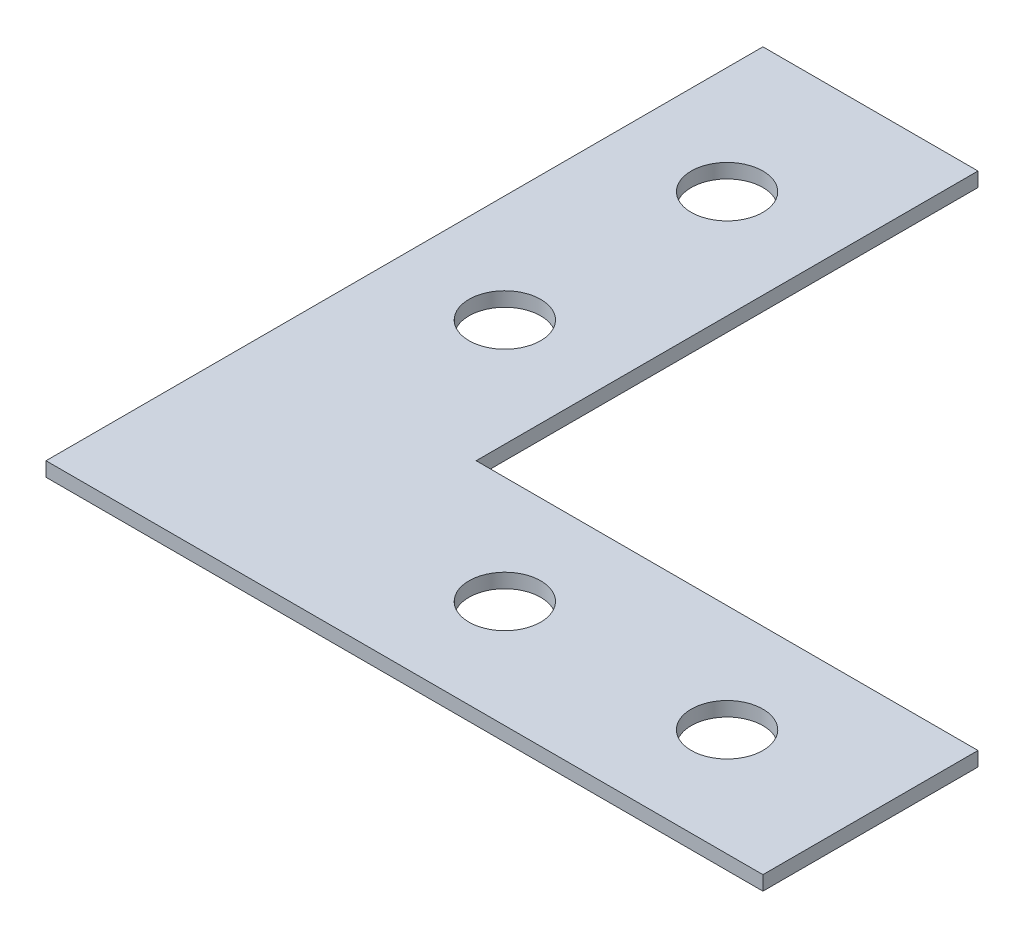
ISO-10303-21;
HEADER;
FILE_DESCRIPTION(('STEP AP214'),'2;1');
FILE_NAME('part.step','',(''),(''),'','','');
FILE_SCHEMA(('AUTOMOTIVE_DESIGN { 1 0 10303 214 1 1 1 1 }'));
ENDSEC;
DATA;
#1=APPLICATION_CONTEXT('core data for automotive mechanical design processes');
#2=APPLICATION_PROTOCOL_DEFINITION('international standard','automotive_design',2000,#1);
#3=PRODUCT_CONTEXT('',#1,'mechanical');
#4=PRODUCT('Part','Part','',(#3));
#5=PRODUCT_RELATED_PRODUCT_CATEGORY('part','',(#4));
#6=PRODUCT_DEFINITION_FORMATION('','',#4);
#7=PRODUCT_DEFINITION_CONTEXT('part definition',#1,'design');
#8=PRODUCT_DEFINITION('design','',#6,#7);
#9=PRODUCT_DEFINITION_SHAPE('','',#8);
#10=(LENGTH_UNIT() NAMED_UNIT(*) SI_UNIT(.MILLI.,.METRE.));
#11=(NAMED_UNIT(*) PLANE_ANGLE_UNIT() SI_UNIT($,.RADIAN.));
#12=(NAMED_UNIT(*) SI_UNIT($,.STERADIAN.) SOLID_ANGLE_UNIT());
#13=UNCERTAINTY_MEASURE_WITH_UNIT(LENGTH_MEASURE(1.E-05),#10,'distance_accuracy_value','');
#14=(GEOMETRIC_REPRESENTATION_CONTEXT(3) GLOBAL_UNCERTAINTY_ASSIGNED_CONTEXT((#13)) GLOBAL_UNIT_ASSIGNED_CONTEXT((#10,
#11,#12)) REPRESENTATION_CONTEXT('',''));
#15=CARTESIAN_POINT('',(0.,0.,0.));
#16=DIRECTION('',(0.,0.,1.));
#17=DIRECTION('',(1.,0.,0.));
#18=AXIS2_PLACEMENT_3D('',#15,#16,#17);
#19=CARTESIAN_POINT('',(0.,1.,0.));
#20=DIRECTION('',(0.,-1.,0.));
#21=DIRECTION('',(0.,0.,-1.));
#22=AXIS2_PLACEMENT_3D('',#19,#20,#21);
#23=PLANE('',#22);
#24=CARTESIAN_POINT('',(7.5,1.,-24.5));
#25=DIRECTION('',(0.,1.,0.));
#26=DIRECTION('',(0.,0.,1.));
#27=AXIS2_PLACEMENT_3D('',#24,#25,#26);
#28=CIRCLE('',#27,2.5);
#29=CARTESIAN_POINT('',(7.5,1.,-22.));
#30=VERTEX_POINT('',#29);
#31=EDGE_CURVE('E212',#30,#30,#28,.T.);
#32=ORIENTED_EDGE('',*,*,#31,.F.);
#33=EDGE_LOOP('',(#32));
#34=FACE_BOUND('',#33,.T.);
#35=CARTESIAN_POINT('',(24.5,1.,-7.5));
#36=DIRECTION('',(0.,1.,0.));
#37=DIRECTION('',(0.,0.,1.));
#38=AXIS2_PLACEMENT_3D('',#35,#36,#37);
#39=CIRCLE('',#38,2.5);
#40=CARTESIAN_POINT('',(24.5,1.,-5.));
#41=VERTEX_POINT('',#40);
#42=EDGE_CURVE('E222',#41,#41,#39,.F.);
#43=ORIENTED_EDGE('',*,*,#42,.T.);
#44=EDGE_LOOP('',(#43));
#45=FACE_BOUND('',#44,.T.);
#46=CARTESIAN_POINT('',(40.,1.,-7.50000000000001));
#47=DIRECTION('',(0.,1.,0.));
#48=DIRECTION('',(0.,0.,1.));
#49=AXIS2_PLACEMENT_3D('',#46,#47,#48);
#50=CIRCLE('',#49,2.5);
#51=CARTESIAN_POINT('',(40.,1.,-5.00000000000001));
#52=VERTEX_POINT('',#51);
#53=EDGE_CURVE('E230',#52,#52,#50,.F.);
#54=ORIENTED_EDGE('',*,*,#53,.T.);
#55=EDGE_LOOP('',(#54));
#56=FACE_BOUND('',#55,.T.);
#57=DIRECTION('',(1.,0.,0.));
#58=VECTOR('',#57,1.);
#59=CARTESIAN_POINT('',(50.,1.,0.));
#60=LINE('',#59,#58);
#61=CARTESIAN_POINT('',(0.,1.,0.));
#62=VERTEX_POINT('',#61);
#63=CARTESIAN_POINT('',(50.,1.,0.));
#64=VERTEX_POINT('',#63);
#65=EDGE_CURVE('E146',#62,#64,#60,.T.);
#66=ORIENTED_EDGE('',*,*,#65,.T.);
#67=DIRECTION('',(0.,0.,-1.));
#68=VECTOR('',#67,1.);
#69=CARTESIAN_POINT('',(50.,1.,-15.));
#70=LINE('',#69,#68);
#71=CARTESIAN_POINT('',(50.,1.,-15.));
#72=VERTEX_POINT('',#71);
#73=EDGE_CURVE('E94',#64,#72,#70,.T.);
#74=ORIENTED_EDGE('',*,*,#73,.T.);
#75=DIRECTION('',(-1.,0.,0.));
#76=VECTOR('',#75,1.);
#77=CARTESIAN_POINT('',(15.,1.,-15.));
#78=LINE('',#77,#76);
#79=CARTESIAN_POINT('',(15.,1.,-15.));
#80=VERTEX_POINT('',#79);
#81=EDGE_CURVE('E107',#72,#80,#78,.T.);
#82=ORIENTED_EDGE('',*,*,#81,.T.);
#83=DIRECTION('',(0.,0.,-1.));
#84=VECTOR('',#83,1.);
#85=CARTESIAN_POINT('',(15.,1.,-50.));
#86=LINE('',#85,#84);
#87=CARTESIAN_POINT('',(15.,1.,-50.));
#88=VERTEX_POINT('',#87);
#89=EDGE_CURVE('E101',#80,#88,#86,.T.);
#90=ORIENTED_EDGE('',*,*,#89,.T.);
#91=DIRECTION('',(-1.,0.,0.));
#92=VECTOR('',#91,1.);
#93=CARTESIAN_POINT('',(0.,1.,-50.));
#94=LINE('',#93,#92);
#95=CARTESIAN_POINT('',(0.,1.,-50.));
#96=VERTEX_POINT('',#95);
#97=EDGE_CURVE('E105',#88,#96,#94,.T.);
#98=ORIENTED_EDGE('',*,*,#97,.T.);
#99=DIRECTION('',(0.,0.,1.));
#100=VECTOR('',#99,1.);
#101=CARTESIAN_POINT('',(0.,1.,0.));
#102=LINE('',#101,#100);
#103=EDGE_CURVE('E57',#96,#62,#102,.T.);
#104=ORIENTED_EDGE('',*,*,#103,.T.);
#105=EDGE_LOOP('',(#66,#74,#82,#90,#98,#104));
#106=FACE_BOUND('',#105,.T.);
#107=CARTESIAN_POINT('',(7.5,1.,-40.));
#108=DIRECTION('',(0.,1.,0.));
#109=DIRECTION('',(0.,0.,1.));
#110=AXIS2_PLACEMENT_3D('',#107,#108,#109);
#111=CIRCLE('',#110,2.5);
#112=CARTESIAN_POINT('',(7.5,1.,-37.5));
#113=VERTEX_POINT('',#112);
#114=EDGE_CURVE('E204',#113,#113,#111,.T.);
#115=ORIENTED_EDGE('',*,*,#114,.F.);
#116=EDGE_LOOP('',(#115));
#117=FACE_BOUND('',#116,.T.);
#118=ADVANCED_FACE('F39',(#34,#45,#56,#106,#117),#23,.F.);
#119=CARTESIAN_POINT('',(0.,0.,0.));
#120=DIRECTION('',(0.,-1.,0.));
#121=DIRECTION('',(0.,0.,-1.));
#122=AXIS2_PLACEMENT_3D('',#119,#120,#121);
#123=PLANE('',#122);
#124=CARTESIAN_POINT('',(24.5,0.,-7.5));
#125=DIRECTION('',(0.,1.,0.));
#126=DIRECTION('',(0.,0.,1.));
#127=AXIS2_PLACEMENT_3D('',#124,#125,#126);
#128=CIRCLE('',#127,2.5);
#129=CARTESIAN_POINT('',(24.5,0.,-5.));
#130=VERTEX_POINT('',#129);
#131=EDGE_CURVE('E218',#130,#130,#128,.F.);
#132=ORIENTED_EDGE('',*,*,#131,.F.);
#133=EDGE_LOOP('',(#132));
#134=FACE_BOUND('',#133,.T.);
#135=CARTESIAN_POINT('',(40.,0.,-7.50000000000001));
#136=DIRECTION('',(0.,1.,0.));
#137=DIRECTION('',(0.,0.,1.));
#138=AXIS2_PLACEMENT_3D('',#135,#136,#137);
#139=CIRCLE('',#138,2.5);
#140=CARTESIAN_POINT('',(40.,0.,-5.00000000000001));
#141=VERTEX_POINT('',#140);
#142=EDGE_CURVE('E226',#141,#141,#139,.F.);
#143=ORIENTED_EDGE('',*,*,#142,.F.);
#144=EDGE_LOOP('',(#143));
#145=FACE_BOUND('',#144,.T.);
#146=DIRECTION('',(1.,0.,0.));
#147=VECTOR('',#146,1.);
#148=CARTESIAN_POINT('',(50.,0.,0.));
#149=LINE('',#148,#147);
#150=CARTESIAN_POINT('',(0.,0.,0.));
#151=VERTEX_POINT('',#150);
#152=CARTESIAN_POINT('',(50.,0.,0.));
#153=VERTEX_POINT('',#152);
#154=EDGE_CURVE('E129',#151,#153,#149,.T.);
#155=ORIENTED_EDGE('',*,*,#154,.F.);
#156=DIRECTION('',(0.,0.,1.));
#157=VECTOR('',#156,1.);
#158=CARTESIAN_POINT('',(0.,0.,0.));
#159=LINE('',#158,#157);
#160=CARTESIAN_POINT('',(0.,0.,-50.));
#161=VERTEX_POINT('',#160);
#162=EDGE_CURVE('E86',#161,#151,#159,.T.);
#163=ORIENTED_EDGE('',*,*,#162,.F.);
#164=DIRECTION('',(-1.,0.,0.));
#165=VECTOR('',#164,1.);
#166=CARTESIAN_POINT('',(0.,0.,-50.));
#167=LINE('',#166,#165);
#168=CARTESIAN_POINT('',(15.,0.,-50.));
#169=VERTEX_POINT('',#168);
#170=EDGE_CURVE('E80',#169,#161,#167,.T.);
#171=ORIENTED_EDGE('',*,*,#170,.F.);
#172=DIRECTION('',(0.,0.,-1.));
#173=VECTOR('',#172,1.);
#174=CARTESIAN_POINT('',(15.,0.,-50.));
#175=LINE('',#174,#173);
#176=CARTESIAN_POINT('',(15.,0.,-15.));
#177=VERTEX_POINT('',#176);
#178=EDGE_CURVE('E116',#177,#169,#175,.T.);
#179=ORIENTED_EDGE('',*,*,#178,.F.);
#180=DIRECTION('',(-1.,0.,0.));
#181=VECTOR('',#180,1.);
#182=CARTESIAN_POINT('',(15.,0.,-15.));
#183=LINE('',#182,#181);
#184=CARTESIAN_POINT('',(50.,0.,-15.));
#185=VERTEX_POINT('',#184);
#186=EDGE_CURVE('E137',#185,#177,#183,.T.);
#187=ORIENTED_EDGE('',*,*,#186,.F.);
#188=DIRECTION('',(0.,0.,-1.));
#189=VECTOR('',#188,1.);
#190=CARTESIAN_POINT('',(50.,0.,-15.));
#191=LINE('',#190,#189);
#192=EDGE_CURVE('E133',#153,#185,#191,.T.);
#193=ORIENTED_EDGE('',*,*,#192,.F.);
#194=EDGE_LOOP('',(#155,#163,#171,#179,#187,#193));
#195=FACE_BOUND('',#194,.T.);
#196=CARTESIAN_POINT('',(7.5,0.,-24.5));
#197=DIRECTION('',(0.,1.,0.));
#198=DIRECTION('',(0.,0.,1.));
#199=AXIS2_PLACEMENT_3D('',#196,#197,#198);
#200=CIRCLE('',#199,2.5);
#201=CARTESIAN_POINT('',(7.5,0.,-22.));
#202=VERTEX_POINT('',#201);
#203=EDGE_CURVE('E206',#202,#202,#200,.T.);
#204=ORIENTED_EDGE('',*,*,#203,.T.);
#205=EDGE_LOOP('',(#204));
#206=FACE_BOUND('',#205,.T.);
#207=CARTESIAN_POINT('',(7.5,0.,-40.));
#208=DIRECTION('',(0.,1.,0.));
#209=DIRECTION('',(0.,0.,1.));
#210=AXIS2_PLACEMENT_3D('',#207,#208,#209);
#211=CIRCLE('',#210,2.5);
#212=CARTESIAN_POINT('',(7.5,0.,-37.5));
#213=VERTEX_POINT('',#212);
#214=EDGE_CURVE('E134',#213,#213,#211,.T.);
#215=ORIENTED_EDGE('',*,*,#214,.T.);
#216=EDGE_LOOP('',(#215));
#217=FACE_BOUND('',#216,.T.);
#218=ADVANCED_FACE('F159',(#134,#145,#195,#206,#217),#123,.T.);
#219=CARTESIAN_POINT('',(50.,1.,0.));
#220=DIRECTION('',(0.,0.,-1.));
#221=DIRECTION('',(-1.,0.,0.));
#222=AXIS2_PLACEMENT_3D('',#219,#220,#221);
#223=PLANE('',#222);
#224=ORIENTED_EDGE('',*,*,#154,.T.);
#225=DIRECTION('',(0.,-1.,0.));
#226=VECTOR('',#225,1.);
#227=CARTESIAN_POINT('',(50.,1.,0.));
#228=LINE('',#227,#226);
#229=EDGE_CURVE('E11',#64,#153,#228,.T.);
#230=ORIENTED_EDGE('',*,*,#229,.F.);
#231=ORIENTED_EDGE('',*,*,#65,.F.);
#232=DIRECTION('',(0.,-1.,0.));
#233=VECTOR('',#232,1.);
#234=CARTESIAN_POINT('',(0.,1.,0.));
#235=LINE('',#234,#233);
#236=EDGE_CURVE('E125',#62,#151,#235,.T.);
#237=ORIENTED_EDGE('',*,*,#236,.T.);
#238=EDGE_LOOP('',(#224,#230,#231,#237));
#239=FACE_BOUND('',#238,.T.);
#240=ADVANCED_FACE('F41',(#239),#223,.F.);
#241=CARTESIAN_POINT('',(50.,1.,-15.));
#242=DIRECTION('',(-1.,0.,0.));
#243=DIRECTION('',(0.,0.,1.));
#244=AXIS2_PLACEMENT_3D('',#241,#242,#243);
#245=PLANE('',#244);
#246=ORIENTED_EDGE('',*,*,#192,.T.);
#247=DIRECTION('',(0.,-1.,0.));
#248=VECTOR('',#247,1.);
#249=CARTESIAN_POINT('',(50.,1.,-15.));
#250=LINE('',#249,#248);
#251=EDGE_CURVE('E49',#72,#185,#250,.T.);
#252=ORIENTED_EDGE('',*,*,#251,.F.);
#253=ORIENTED_EDGE('',*,*,#73,.F.);
#254=ORIENTED_EDGE('',*,*,#229,.T.);
#255=EDGE_LOOP('',(#246,#252,#253,#254));
#256=FACE_BOUND('',#255,.T.);
#257=ADVANCED_FACE('F299',(#256),#245,.F.);
#258=CARTESIAN_POINT('',(15.,1.,-15.));
#259=DIRECTION('',(0.,0.,1.));
#260=DIRECTION('',(1.,0.,0.));
#261=AXIS2_PLACEMENT_3D('',#258,#259,#260);
#262=PLANE('',#261);
#263=ORIENTED_EDGE('',*,*,#186,.T.);
#264=DIRECTION('',(0.,-1.,0.));
#265=VECTOR('',#264,1.);
#266=CARTESIAN_POINT('',(15.,1.,-15.));
#267=LINE('',#266,#265);
#268=EDGE_CURVE('E118',#80,#177,#267,.T.);
#269=ORIENTED_EDGE('',*,*,#268,.F.);
#270=ORIENTED_EDGE('',*,*,#81,.F.);
#271=ORIENTED_EDGE('',*,*,#251,.T.);
#272=EDGE_LOOP('',(#263,#269,#270,#271));
#273=FACE_BOUND('',#272,.T.);
#274=ADVANCED_FACE('F156',(#273),#262,.F.);
#275=CARTESIAN_POINT('',(15.,1.,-50.));
#276=DIRECTION('',(-1.,0.,0.));
#277=DIRECTION('',(0.,0.,1.));
#278=AXIS2_PLACEMENT_3D('',#275,#276,#277);
#279=PLANE('',#278);
#280=ORIENTED_EDGE('',*,*,#178,.T.);
#281=DIRECTION('',(0.,-1.,0.));
#282=VECTOR('',#281,1.);
#283=CARTESIAN_POINT('',(15.,1.,-50.));
#284=LINE('',#283,#282);
#285=EDGE_CURVE('E113',#88,#169,#284,.T.);
#286=ORIENTED_EDGE('',*,*,#285,.F.);
#287=ORIENTED_EDGE('',*,*,#89,.F.);
#288=ORIENTED_EDGE('',*,*,#268,.T.);
#289=EDGE_LOOP('',(#280,#286,#287,#288));
#290=FACE_BOUND('',#289,.T.);
#291=ADVANCED_FACE('F114',(#290),#279,.F.);
#292=CARTESIAN_POINT('',(0.,1.,-50.));
#293=DIRECTION('',(0.,0.,1.));
#294=DIRECTION('',(1.,0.,0.));
#295=AXIS2_PLACEMENT_3D('',#292,#293,#294);
#296=PLANE('',#295);
#297=ORIENTED_EDGE('',*,*,#170,.T.);
#298=DIRECTION('',(0.,-1.,0.));
#299=VECTOR('',#298,1.);
#300=CARTESIAN_POINT('',(0.,1.,-50.));
#301=LINE('',#300,#299);
#302=EDGE_CURVE('E119',#96,#161,#301,.T.);
#303=ORIENTED_EDGE('',*,*,#302,.F.);
#304=ORIENTED_EDGE('',*,*,#97,.F.);
#305=ORIENTED_EDGE('',*,*,#285,.T.);
#306=EDGE_LOOP('',(#297,#303,#304,#305));
#307=FACE_BOUND('',#306,.T.);
#308=ADVANCED_FACE('F121',(#307),#296,.F.);
#309=CARTESIAN_POINT('',(0.,1.,0.));
#310=DIRECTION('',(1.,0.,0.));
#311=DIRECTION('',(0.,0.,-1.));
#312=AXIS2_PLACEMENT_3D('',#309,#310,#311);
#313=PLANE('',#312);
#314=ORIENTED_EDGE('',*,*,#162,.T.);
#315=ORIENTED_EDGE('',*,*,#236,.F.);
#316=ORIENTED_EDGE('',*,*,#103,.F.);
#317=ORIENTED_EDGE('',*,*,#302,.T.);
#318=EDGE_LOOP('',(#314,#315,#316,#317));
#319=FACE_BOUND('',#318,.T.);
#320=ADVANCED_FACE('F164',(#319),#313,.F.);
#321=CARTESIAN_POINT('',(40.,0.,-7.50000000000001));
#322=DIRECTION('',(0.,1.,0.));
#323=DIRECTION('',(0.,0.,1.));
#324=AXIS2_PLACEMENT_3D('',#321,#322,#323);
#325=CYLINDRICAL_SURFACE('',#324,2.5);
#326=ORIENTED_EDGE('',*,*,#142,.T.);
#327=EDGE_LOOP('',(#326));
#328=FACE_BOUND('',#327,.T.);
#329=ORIENTED_EDGE('',*,*,#53,.F.);
#330=EDGE_LOOP('',(#329));
#331=FACE_BOUND('',#330,.T.);
#332=ADVANCED_FACE('F166',(#328,#331),#325,.F.);
#333=CARTESIAN_POINT('',(24.5,0.,-7.5));
#334=DIRECTION('',(0.,1.,0.));
#335=DIRECTION('',(0.,0.,1.));
#336=AXIS2_PLACEMENT_3D('',#333,#334,#335);
#337=CYLINDRICAL_SURFACE('',#336,2.5);
#338=ORIENTED_EDGE('',*,*,#131,.T.);
#339=EDGE_LOOP('',(#338));
#340=FACE_BOUND('',#339,.T.);
#341=ORIENTED_EDGE('',*,*,#42,.F.);
#342=EDGE_LOOP('',(#341));
#343=FACE_BOUND('',#342,.T.);
#344=ADVANCED_FACE('F172',(#340,#343),#337,.F.);
#345=CARTESIAN_POINT('',(7.5,0.,-24.5));
#346=DIRECTION('',(0.,1.,0.));
#347=DIRECTION('',(0.,0.,1.));
#348=AXIS2_PLACEMENT_3D('',#345,#346,#347);
#349=CYLINDRICAL_SURFACE('',#348,2.5);
#350=ORIENTED_EDGE('',*,*,#203,.F.);
#351=EDGE_LOOP('',(#350));
#352=FACE_BOUND('',#351,.T.);
#353=ORIENTED_EDGE('',*,*,#31,.T.);
#354=EDGE_LOOP('',(#353));
#355=FACE_BOUND('',#354,.T.);
#356=ADVANCED_FACE('F189',(#352,#355),#349,.F.);
#357=CARTESIAN_POINT('',(7.5,0.,-40.));
#358=DIRECTION('',(0.,1.,0.));
#359=DIRECTION('',(0.,0.,1.));
#360=AXIS2_PLACEMENT_3D('',#357,#358,#359);
#361=CYLINDRICAL_SURFACE('',#360,2.5);
#362=ORIENTED_EDGE('',*,*,#214,.F.);
#363=EDGE_LOOP('',(#362));
#364=FACE_BOUND('',#363,.T.);
#365=ORIENTED_EDGE('',*,*,#114,.T.);
#366=EDGE_LOOP('',(#365));
#367=FACE_BOUND('',#366,.T.);
#368=ADVANCED_FACE('F193',(#364,#367),#361,.F.);
#369=CLOSED_SHELL('',(#118,#218,#240,#257,#274,#291,#308,#320,#332,#344,#356,#368));
#370=MANIFOLD_SOLID_BREP('B2',#369);
#371=ADVANCED_BREP_SHAPE_REPRESENTATION('',(#18,#370),#14);
#372=SHAPE_DEFINITION_REPRESENTATION(#9,#371);
ENDSEC;
END-ISO-10303-21;
